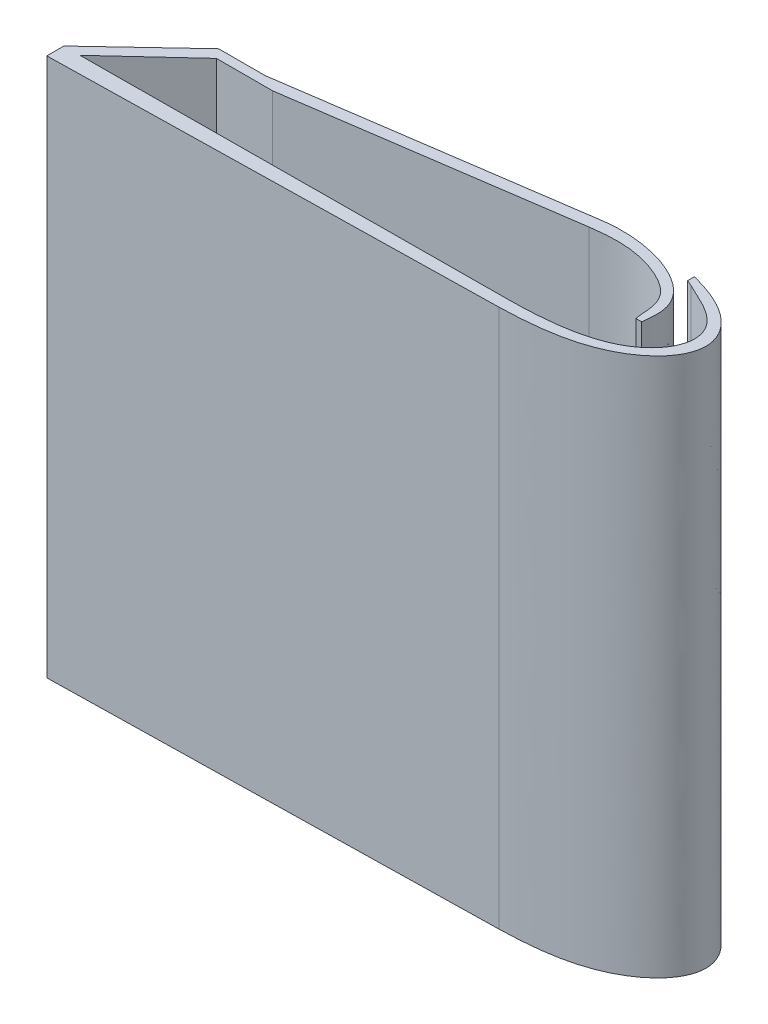
ISO-10303-21;
HEADER;
FILE_DESCRIPTION(('STEP AP214'),'2;1');
FILE_NAME('part.step','',(''),(''),'','','');
FILE_SCHEMA(('AUTOMOTIVE_DESIGN { 1 0 10303 214 1 1 1 1 }'));
ENDSEC;
DATA;
#1=APPLICATION_CONTEXT('core data for automotive mechanical design processes');
#2=APPLICATION_PROTOCOL_DEFINITION('international standard','automotive_design',2000,#1);
#3=PRODUCT_CONTEXT('',#1,'mechanical');
#4=PRODUCT('Part','Part','',(#3));
#5=PRODUCT_RELATED_PRODUCT_CATEGORY('part','',(#4));
#6=PRODUCT_DEFINITION_FORMATION('','',#4);
#7=PRODUCT_DEFINITION_CONTEXT('part definition',#1,'design');
#8=PRODUCT_DEFINITION('design','',#6,#7);
#9=PRODUCT_DEFINITION_SHAPE('','',#8);
#10=(LENGTH_UNIT() NAMED_UNIT(*) SI_UNIT(.MILLI.,.METRE.));
#11=(NAMED_UNIT(*) PLANE_ANGLE_UNIT() SI_UNIT($,.RADIAN.));
#12=(NAMED_UNIT(*) SI_UNIT($,.STERADIAN.) SOLID_ANGLE_UNIT());
#13=UNCERTAINTY_MEASURE_WITH_UNIT(LENGTH_MEASURE(1.E-05),#10,'distance_accuracy_value','');
#14=(GEOMETRIC_REPRESENTATION_CONTEXT(3) GLOBAL_UNCERTAINTY_ASSIGNED_CONTEXT((#13)) GLOBAL_UNIT_ASSIGNED_CONTEXT((#10,
#11,#12)) REPRESENTATION_CONTEXT('',''));
#15=CARTESIAN_POINT('',(0.,0.,0.));
#16=DIRECTION('',(0.,0.,1.));
#17=DIRECTION('',(1.,0.,0.));
#18=AXIS2_PLACEMENT_3D('',#15,#16,#17);
#19=CARTESIAN_POINT('',(11.8502255321829,80.,-13.6725618085625));
#20=DIRECTION('',(0.,0.,1.));
#21=DIRECTION('',(1.,0.,0.));
#22=AXIS2_PLACEMENT_3D('',#19,#20,#21);
#23=PLANE('',#22);
#24=DIRECTION('',(-1.,0.,0.));
#25=VECTOR('',#24,1.);
#26=CARTESIAN_POINT('',(11.8502255321829,0.,-13.6725618085625));
#27=LINE('',#26,#25);
#28=CARTESIAN_POINT('',(18.752013582639,0.,-13.6725618085625));
#29=VERTEX_POINT('',#28);
#30=CARTESIAN_POINT('',(11.8502255321829,0.,-13.6725618085625));
#31=VERTEX_POINT('',#30);
#32=EDGE_CURVE('E341',#29,#31,#27,.T.);
#33=ORIENTED_EDGE('',*,*,#32,.T.);
#34=DIRECTION('',(0.,-1.,0.));
#35=VECTOR('',#34,1.);
#36=CARTESIAN_POINT('',(11.8502255321829,80.,-13.6725618085625));
#37=LINE('',#36,#35);
#38=CARTESIAN_POINT('',(11.8502255321829,80.,-13.6725618085625));
#39=VERTEX_POINT('',#38);
#40=EDGE_CURVE('E11',#39,#31,#37,.T.);
#41=ORIENTED_EDGE('',*,*,#40,.F.);
#42=DIRECTION('',(-1.,0.,0.));
#43=VECTOR('',#42,1.);
#44=CARTESIAN_POINT('',(11.8502255321829,80.,-13.6725618085625));
#45=LINE('',#44,#43);
#46=CARTESIAN_POINT('',(18.752013582639,80.,-13.6725618085625));
#47=VERTEX_POINT('',#46);
#48=EDGE_CURVE('E378',#47,#39,#45,.T.);
#49=ORIENTED_EDGE('',*,*,#48,.F.);
#50=DIRECTION('',(0.,-1.,0.));
#51=VECTOR('',#50,1.);
#52=CARTESIAN_POINT('',(18.752013582639,80.,-13.6725618085625));
#53=LINE('',#52,#51);
#54=EDGE_CURVE('E175',#47,#29,#53,.T.);
#55=ORIENTED_EDGE('',*,*,#54,.T.);
#56=EDGE_LOOP('',(#33,#41,#49,#55));
#57=FACE_BOUND('',#56,.T.);
#58=ADVANCED_FACE('F35',(#57),#23,.F.);
#59=CARTESIAN_POINT('',(0.,80.,-2.53170122080573));
#60=DIRECTION('',(0.684963818042656,0.,0.728577084440917));
#61=DIRECTION('',(0.728577084440917,0.,-0.684963818042656));
#62=AXIS2_PLACEMENT_3D('',#59,#60,#61);
#63=PLANE('',#62);
#64=DIRECTION('',(-0.728577084440917,0.,0.684963818042656));
#65=VECTOR('',#64,1.);
#66=CARTESIAN_POINT('',(0.,0.,-2.53170122080573));
#67=LINE('',#66,#65);
#68=CARTESIAN_POINT('',(0.,0.,-2.53170122080573));
#69=VERTEX_POINT('',#68);
#70=EDGE_CURVE('E335',#31,#69,#67,.T.);
#71=ORIENTED_EDGE('',*,*,#70,.T.);
#72=DIRECTION('',(0.,-1.,0.));
#73=VECTOR('',#72,1.);
#74=CARTESIAN_POINT('',(0.,80.,-2.53170122080573));
#75=LINE('',#74,#73);
#76=CARTESIAN_POINT('',(0.,80.,-2.53170122080573));
#77=VERTEX_POINT('',#76);
#78=EDGE_CURVE('E43',#77,#69,#75,.T.);
#79=ORIENTED_EDGE('',*,*,#78,.F.);
#80=DIRECTION('',(-0.728577084440917,0.,0.684963818042656));
#81=VECTOR('',#80,1.);
#82=CARTESIAN_POINT('',(0.,80.,-2.53170122080573));
#83=LINE('',#82,#81);
#84=EDGE_CURVE('E118',#39,#77,#83,.T.);
#85=ORIENTED_EDGE('',*,*,#84,.F.);
#86=ORIENTED_EDGE('',*,*,#40,.T.);
#87=EDGE_LOOP('',(#71,#79,#85,#86));
#88=FACE_BOUND('',#87,.T.);
#89=ADVANCED_FACE('F395',(#88),#63,.F.);
#90=CARTESIAN_POINT('',(0.,80.,0.));
#91=DIRECTION('',(1.,0.,0.));
#92=DIRECTION('',(0.,0.,-1.));
#93=AXIS2_PLACEMENT_3D('',#90,#91,#92);
#94=PLANE('',#93);
#95=DIRECTION('',(0.,0.,1.));
#96=VECTOR('',#95,1.);
#97=CARTESIAN_POINT('',(0.,0.,0.));
#98=LINE('',#97,#96);
#99=CARTESIAN_POINT('',(0.,0.,0.));
#100=VERTEX_POINT('',#99);
#101=EDGE_CURVE('E329',#69,#100,#98,.T.);
#102=ORIENTED_EDGE('',*,*,#101,.T.);
#103=DIRECTION('',(0.,-1.,0.));
#104=VECTOR('',#103,1.);
#105=CARTESIAN_POINT('',(0.,80.,0.));
#106=LINE('',#105,#104);
#107=CARTESIAN_POINT('',(0.,80.,0.));
#108=VERTEX_POINT('',#107);
#109=EDGE_CURVE('E321',#108,#100,#106,.T.);
#110=ORIENTED_EDGE('',*,*,#109,.F.);
#111=DIRECTION('',(0.,0.,1.));
#112=VECTOR('',#111,1.);
#113=CARTESIAN_POINT('',(0.,80.,0.));
#114=LINE('',#113,#112);
#115=EDGE_CURVE('E330',#77,#108,#114,.T.);
#116=ORIENTED_EDGE('',*,*,#115,.F.);
#117=ORIENTED_EDGE('',*,*,#78,.T.);
#118=EDGE_LOOP('',(#102,#110,#116,#117));
#119=FACE_BOUND('',#118,.T.);
#120=ADVANCED_FACE('F327',(#119),#94,.F.);
#121=CARTESIAN_POINT('',(0.,80.,0.));
#122=DIRECTION('',(-0.0190868223282062,0.,-0.999817830013754));
#123=DIRECTION('',(-0.999817830013754,0.,0.0190868223282062));
#124=AXIS2_PLACEMENT_3D('',#121,#122,#123);
#125=PLANE('',#124);
#126=DIRECTION('',(0.999817830013754,0.,-0.0190868223282062));
#127=VECTOR('',#126,1.);
#128=CARTESIAN_POINT('',(0.,0.,0.));
#129=LINE('',#128,#127);
#130=CARTESIAN_POINT('',(65.8986461709387,0.,-1.25802492551741));
#131=VERTEX_POINT('',#130);
#132=EDGE_CURVE('E337',#100,#131,#129,.T.);
#133=ORIENTED_EDGE('',*,*,#132,.T.);
#134=DIRECTION('',(0.,-1.,0.));
#135=VECTOR('',#134,1.);
#136=CARTESIAN_POINT('',(65.8986461709387,80.,-1.25802492551741));
#137=LINE('',#136,#135);
#138=CARTESIAN_POINT('',(65.8986461709387,80.,-1.25802492551741));
#139=VERTEX_POINT('',#138);
#140=EDGE_CURVE('E318',#139,#131,#137,.T.);
#141=ORIENTED_EDGE('',*,*,#140,.F.);
#142=DIRECTION('',(0.999817830013754,0.,-0.0190868223282062));
#143=VECTOR('',#142,1.);
#144=CARTESIAN_POINT('',(0.,80.,0.));
#145=LINE('',#144,#143);
#146=EDGE_CURVE('E253',#108,#139,#145,.T.);
#147=ORIENTED_EDGE('',*,*,#146,.F.);
#148=ORIENTED_EDGE('',*,*,#109,.T.);
#149=EDGE_LOOP('',(#133,#141,#147,#148));
#150=FACE_BOUND('',#149,.T.);
#151=ADVANCED_FACE('F244',(#150),#125,.F.);
#152=CARTESIAN_POINT('',(65.8986461709387,80.,-1.25802492551741));
#153=CARTESIAN_POINT('',(71.6261804742318,80.,-1.36736527367279));
#154=CARTESIAN_POINT('',(75.5471970860919,80.,-2.13947163177114));
#155=CARTESIAN_POINT('',(83.1460051067004,80.,-2.27545301593973));
#156=CARTESIAN_POINT('',(83.9690789300761,80.,-6.95707353405025));
#157=CARTESIAN_POINT('',(91.8384314116689,80.,-10.0088557614399));
#158=CARTESIAN_POINT('',(86.8239541314267,80.,-13.9158318373423));
#159=CARTESIAN_POINT('',(85.4413967770104,80.,-17.4009165161795));
#160=CARTESIAN_POINT('',(80.0436255282191,80.,-18.6263759195708));
#161=CARTESIAN_POINT('',(76.492845436451,80.,-19.6990962686313));
#162=B_SPLINE_CURVE_WITH_KNOTS('',9,(#152,#153,#154,#155,#156,#157,#158,#159,#160,#161),
.UNSPECIFIED.,.F.,.F.,(10,10),(0.,1.),.UNSPECIFIED.);
#163=DIRECTION('',(0.,-1.,0.));
#164=VECTOR('',#163,1.);
#165=SURFACE_OF_LINEAR_EXTRUSION('',#162,#164);
#166=CARTESIAN_POINT('',(65.8986461709387,0.,-1.25802492551741));
#167=CARTESIAN_POINT('',(71.6261804742318,0.,-1.36736527367279));
#168=CARTESIAN_POINT('',(75.5471970860919,0.,-2.13947163177114));
#169=CARTESIAN_POINT('',(83.1460051067004,0.,-2.27545301593973));
#170=CARTESIAN_POINT('',(83.9690789300761,0.,-6.95707353405025));
#171=CARTESIAN_POINT('',(91.8384314116689,0.,-10.0088557614399));
#172=CARTESIAN_POINT('',(86.8239541314267,0.,-13.9158318373423));
#173=CARTESIAN_POINT('',(85.4413967770104,0.,-17.4009165161795));
#174=CARTESIAN_POINT('',(80.0436255282191,0.,-18.6263759195708));
#175=CARTESIAN_POINT('',(76.492845436451,0.,-19.6990962686313));
#176=B_SPLINE_CURVE_WITH_KNOTS('',9,(#166,#167,#168,#169,#170,#171,#172,#173,#174,#175),
.UNSPECIFIED.,.F.,.F.,(10,10),(0.,1.),.UNSPECIFIED.);
#177=CARTESIAN_POINT('',(76.492845436451,0.,-19.6990962686313));
#178=VERTEX_POINT('',#177);
#179=EDGE_CURVE('E339',#131,#178,#176,.T.);
#180=ORIENTED_EDGE('',*,*,#179,.T.);
#181=DIRECTION('',(0.,-1.,0.));
#182=VECTOR('',#181,1.);
#183=CARTESIAN_POINT('',(76.492845436451,80.,-19.6990962686313));
#184=LINE('',#183,#182);
#185=CARTESIAN_POINT('',(76.492845436451,80.,-19.6990962686313));
#186=VERTEX_POINT('',#185);
#187=EDGE_CURVE('E315',#186,#178,#184,.T.);
#188=ORIENTED_EDGE('',*,*,#187,.F.);
#189=EDGE_CURVE('E247',#139,#186,#162,.T.);
#190=ORIENTED_EDGE('',*,*,#189,.F.);
#191=ORIENTED_EDGE('',*,*,#140,.T.);
#192=EDGE_LOOP('',(#180,#188,#190,#191));
#193=FACE_BOUND('',#192,.T.);
#194=ADVANCED_FACE('F239',(#193),#165,.F.);
#195=CARTESIAN_POINT('',(76.492845436451,80.,-19.6990962686313));
#196=DIRECTION('',(1.,0.,0.));
#197=DIRECTION('',(0.,0.,-1.));
#198=AXIS2_PLACEMENT_3D('',#195,#196,#197);
#199=PLANE('',#198);
#200=DIRECTION('',(0.,0.,1.));
#201=VECTOR('',#200,1.);
#202=CARTESIAN_POINT('',(76.492845436451,0.,-19.6990962686313));
#203=LINE('',#202,#201);
#204=CARTESIAN_POINT('',(76.492845436451,0.,-18.6847335560517));
#205=VERTEX_POINT('',#204);
#206=EDGE_CURVE('E347',#178,#205,#203,.T.);
#207=ORIENTED_EDGE('',*,*,#206,.T.);
#208=DIRECTION('',(0.,-1.,0.));
#209=VECTOR('',#208,1.);
#210=CARTESIAN_POINT('',(76.492845436451,80.,-18.6847335560517));
#211=LINE('',#210,#209);
#212=CARTESIAN_POINT('',(76.492845436451,80.,-18.6847335560517));
#213=VERTEX_POINT('',#212);
#214=EDGE_CURVE('E270',#213,#205,#211,.T.);
#215=ORIENTED_EDGE('',*,*,#214,.F.);
#216=DIRECTION('',(0.,0.,1.));
#217=VECTOR('',#216,1.);
#218=CARTESIAN_POINT('',(76.492845436451,80.,-19.6990962686313));
#219=LINE('',#218,#217);
#220=EDGE_CURVE('E252',#186,#213,#219,.T.);
#221=ORIENTED_EDGE('',*,*,#220,.F.);
#222=ORIENTED_EDGE('',*,*,#187,.T.);
#223=EDGE_LOOP('',(#207,#215,#221,#222));
#224=FACE_BOUND('',#223,.T.);
#225=ADVANCED_FACE('F235',(#224),#199,.F.);
#226=CARTESIAN_POINT('',(76.492845436451,80.,-18.6847335560517));
#227=DIRECTION('',(0.402455337108583,0.,-0.915439622057521));
#228=DIRECTION('',(-0.915439622057521,0.,-0.402455337108583));
#229=AXIS2_PLACEMENT_3D('',#226,#227,#228);
#230=PLANE('',#229);
#231=DIRECTION('',(0.915439622057521,0.,0.402455337108583));
#232=VECTOR('',#231,1.);
#233=CARTESIAN_POINT('',(76.492845436451,0.,-18.6847335560517));
#234=LINE('',#233,#232);
#235=CARTESIAN_POINT('',(77.3273000433491,0.,-18.3178817156581));
#236=VERTEX_POINT('',#235);
#237=EDGE_CURVE('E268',#205,#236,#234,.T.);
#238=ORIENTED_EDGE('',*,*,#237,.T.);
#239=DIRECTION('',(0.,-1.,0.));
#240=VECTOR('',#239,1.);
#241=CARTESIAN_POINT('',(77.3273000433491,80.,-18.3178817156581));
#242=LINE('',#241,#240);
#243=CARTESIAN_POINT('',(77.3273000433491,80.,-18.3178817156581));
#244=VERTEX_POINT('',#243);
#245=EDGE_CURVE('E266',#244,#236,#242,.T.);
#246=ORIENTED_EDGE('',*,*,#245,.F.);
#247=DIRECTION('',(0.915439622057521,0.,0.402455337108583));
#248=VECTOR('',#247,1.);
#249=CARTESIAN_POINT('',(76.492845436451,80.,-18.6847335560517));
#250=LINE('',#249,#248);
#251=EDGE_CURVE('E219',#213,#244,#250,.T.);
#252=ORIENTED_EDGE('',*,*,#251,.F.);
#253=ORIENTED_EDGE('',*,*,#214,.T.);
#254=EDGE_LOOP('',(#238,#246,#252,#253));
#255=FACE_BOUND('',#254,.T.);
#256=ADVANCED_FACE('F230',(#255),#230,.F.);
#257=CARTESIAN_POINT('',(77.3273000433491,80.,-18.3178817156581));
#258=CARTESIAN_POINT('',(80.8503986390824,80.,-16.418487187674));
#259=CARTESIAN_POINT('',(86.9170084419523,80.,-15.2408511671169));
#260=CARTESIAN_POINT('',(85.7286299391944,80.,-11.0458082011466));
#261=CARTESIAN_POINT('',(84.3098234268337,80.,-9.71996342880963));
#262=CARTESIAN_POINT('',(84.61142585038,80.,-6.77864383396584));
#263=CARTESIAN_POINT('',(80.5075427484385,80.,-4.95866089310484));
#264=CARTESIAN_POINT('',(77.9727473934529,80.,-4.77919228413985));
#265=CARTESIAN_POINT('',(77.1887503268685,80.,-3.28142171231137));
#266=CARTESIAN_POINT('',(70.722703041989,80.,-2.95755547651348));
#267=CARTESIAN_POINT('',(65.2772208482399,80.,-2.9236177021232));
#268=B_SPLINE_CURVE_WITH_KNOTS('',10,(#257,#258,#259,#260,#261,#262,#263,#264,#265,#266,#267),
.UNSPECIFIED.,.F.,.F.,(11,11),(0.,1.),.UNSPECIFIED.);
#269=DIRECTION('',(0.,-1.,0.));
#270=VECTOR('',#269,1.);
#271=SURFACE_OF_LINEAR_EXTRUSION('',#268,#270);
#272=CARTESIAN_POINT('',(77.3273000433491,0.,-18.3178817156581));
#273=CARTESIAN_POINT('',(80.8503986390824,0.,-16.418487187674));
#274=CARTESIAN_POINT('',(86.9170084419523,0.,-15.2408511671169));
#275=CARTESIAN_POINT('',(85.7286299391944,0.,-11.0458082011466));
#276=CARTESIAN_POINT('',(84.3098234268337,0.,-9.71996342880963));
#277=CARTESIAN_POINT('',(84.61142585038,0.,-6.77864383396584));
#278=CARTESIAN_POINT('',(80.5075427484385,0.,-4.95866089310484));
#279=CARTESIAN_POINT('',(77.9727473934529,0.,-4.77919228413985));
#280=CARTESIAN_POINT('',(77.1887503268685,0.,-3.28142171231137));
#281=CARTESIAN_POINT('',(70.722703041989,0.,-2.95755547651348));
#282=CARTESIAN_POINT('',(65.2772208482399,0.,-2.9236177021232));
#283=B_SPLINE_CURVE_WITH_KNOTS('',10,(#272,#273,#274,#275,#276,#277,#278,#279,#280,#281,#282),
.UNSPECIFIED.,.F.,.F.,(11,11),(0.,1.),.UNSPECIFIED.);
#284=CARTESIAN_POINT('',(65.2772208482399,0.,-2.9236177021232));
#285=VERTEX_POINT('',#284);
#286=EDGE_CURVE('E275',#236,#285,#283,.T.);
#287=ORIENTED_EDGE('',*,*,#286,.T.);
#288=DIRECTION('',(0.,-1.,0.));
#289=VECTOR('',#288,1.);
#290=CARTESIAN_POINT('',(65.2772208482399,80.,-2.9236177021232));
#291=LINE('',#290,#289);
#292=CARTESIAN_POINT('',(65.2772208482399,80.,-2.9236177021232));
#293=VERTEX_POINT('',#292);
#294=EDGE_CURVE('E271',#293,#285,#291,.T.);
#295=ORIENTED_EDGE('',*,*,#294,.F.);
#296=EDGE_CURVE('E214',#244,#293,#268,.T.);
#297=ORIENTED_EDGE('',*,*,#296,.F.);
#298=ORIENTED_EDGE('',*,*,#245,.T.);
#299=EDGE_LOOP('',(#287,#295,#297,#298));
#300=FACE_BOUND('',#299,.T.);
#301=ADVANCED_FACE('F225',(#300),#271,.F.);
#302=CARTESIAN_POINT('',(2.39230105627136,80.,-2.53170122080573));
#303=DIRECTION('',(0.00623215981761664,0.,0.999980579903434));
#304=DIRECTION('',(0.999980579903434,0.,-0.00623215981761664));
#305=AXIS2_PLACEMENT_3D('',#302,#303,#304);
#306=PLANE('',#305);
#307=DIRECTION('',(-0.999980579903434,0.,0.00623215981761664));
#308=VECTOR('',#307,1.);
#309=CARTESIAN_POINT('',(2.39230105627136,0.,-2.53170122080573));
#310=LINE('',#309,#308);
#311=CARTESIAN_POINT('',(2.39230105627136,0.,-2.53170122080573));
#312=VERTEX_POINT('',#311);
#313=EDGE_CURVE('E356',#285,#312,#310,.T.);
#314=ORIENTED_EDGE('',*,*,#313,.T.);
#315=DIRECTION('',(0.,-1.,0.));
#316=VECTOR('',#315,1.);
#317=CARTESIAN_POINT('',(2.39230105627136,80.,-2.53170122080573));
#318=LINE('',#317,#316);
#319=CARTESIAN_POINT('',(2.39230105627136,80.,-2.53170122080573));
#320=VERTEX_POINT('',#319);
#321=EDGE_CURVE('E278',#320,#312,#318,.T.);
#322=ORIENTED_EDGE('',*,*,#321,.F.);
#323=DIRECTION('',(-0.999980579903434,0.,0.00623215981761664));
#324=VECTOR('',#323,1.);
#325=CARTESIAN_POINT('',(2.39230105627136,80.,-2.53170122080573));
#326=LINE('',#325,#324);
#327=EDGE_CURVE('E212',#293,#320,#326,.T.);
#328=ORIENTED_EDGE('',*,*,#327,.F.);
#329=ORIENTED_EDGE('',*,*,#294,.T.);
#330=EDGE_LOOP('',(#314,#322,#328,#329));
#331=FACE_BOUND('',#330,.T.);
#332=ADVANCED_FACE('F229',(#331),#306,.F.);
#333=CARTESIAN_POINT('',(2.39230105627136,80.,-2.53170122080573));
#334=DIRECTION('',(-0.678837274357454,0.,-0.734288740852631));
#335=DIRECTION('',(-0.734288740852632,0.,0.678837274357454));
#336=AXIS2_PLACEMENT_3D('',#333,#334,#335);
#337=PLANE('',#336);
#338=DIRECTION('',(0.734288740852631,0.,-0.678837274357454));
#339=VECTOR('',#338,1.);
#340=CARTESIAN_POINT('',(2.39230105627136,0.,-2.53170122080573));
#341=LINE('',#340,#339);
#342=CARTESIAN_POINT('',(12.9255150003522,0.,-12.26947581302));
#343=VERTEX_POINT('',#342);
#344=EDGE_CURVE('E291',#312,#343,#341,.T.);
#345=ORIENTED_EDGE('',*,*,#344,.T.);
#346=DIRECTION('',(0.,-1.,0.));
#347=VECTOR('',#346,1.);
#348=CARTESIAN_POINT('',(12.9255150003522,80.,-12.26947581302));
#349=LINE('',#348,#347);
#350=CARTESIAN_POINT('',(12.9255150003522,80.,-12.26947581302));
#351=VERTEX_POINT('',#350);
#352=EDGE_CURVE('E288',#351,#343,#349,.T.);
#353=ORIENTED_EDGE('',*,*,#352,.F.);
#354=DIRECTION('',(0.734288740852631,0.,-0.678837274357454));
#355=VECTOR('',#354,1.);
#356=CARTESIAN_POINT('',(2.39230105627136,80.,-2.53170122080573));
#357=LINE('',#356,#355);
#358=EDGE_CURVE('E210',#320,#351,#357,.T.);
#359=ORIENTED_EDGE('',*,*,#358,.F.);
#360=ORIENTED_EDGE('',*,*,#321,.T.);
#361=EDGE_LOOP('',(#345,#353,#359,#360));
#362=FACE_BOUND('',#361,.T.);
#363=ADVANCED_FACE('F289',(#362),#337,.F.);
#364=CARTESIAN_POINT('',(12.9255150003522,80.,-12.26947581302));
#365=DIRECTION('',(0.,0.,-1.));
#366=DIRECTION('',(-1.,0.,0.));
#367=AXIS2_PLACEMENT_3D('',#364,#365,#366);
#368=PLANE('',#367);
#369=DIRECTION('',(1.,0.,0.));
#370=VECTOR('',#369,1.);
#371=CARTESIAN_POINT('',(12.9255150003522,0.,-12.26947581302));
#372=LINE('',#371,#370);
#373=CARTESIAN_POINT('',(21.2633091462779,0.,-12.26947581302));
#374=VERTEX_POINT('',#373);
#375=EDGE_CURVE('E299',#343,#374,#372,.T.);
#376=ORIENTED_EDGE('',*,*,#375,.T.);
#377=DIRECTION('',(0.,-1.,0.));
#378=VECTOR('',#377,1.);
#379=CARTESIAN_POINT('',(21.2633091462779,80.,-12.26947581302));
#380=LINE('',#379,#378);
#381=CARTESIAN_POINT('',(21.2633091462779,80.,-12.26947581302));
#382=VERTEX_POINT('',#381);
#383=EDGE_CURVE('E294',#382,#374,#380,.T.);
#384=ORIENTED_EDGE('',*,*,#383,.F.);
#385=DIRECTION('',(1.,0.,0.));
#386=VECTOR('',#385,1.);
#387=CARTESIAN_POINT('',(12.9255150003522,80.,-12.26947581302));
#388=LINE('',#387,#386);
#389=EDGE_CURVE('E208',#351,#382,#388,.T.);
#390=ORIENTED_EDGE('',*,*,#389,.F.);
#391=ORIENTED_EDGE('',*,*,#352,.T.);
#392=EDGE_LOOP('',(#376,#384,#390,#391));
#393=FACE_BOUND('',#392,.T.);
#394=ADVANCED_FACE('F296',(#393),#368,.F.);
#395=CARTESIAN_POINT('',(21.2633091462779,80.,-12.26947581302));
#396=DIRECTION('',(-0.144306893071729,0.,-0.989532981063281));
#397=DIRECTION('',(-0.989532981063282,0.,0.14430689307173));
#398=AXIS2_PLACEMENT_3D('',#395,#396,#397);
#399=PLANE('',#398);
#400=DIRECTION('',(0.989532981063281,0.,-0.144306893071729));
#401=VECTOR('',#400,1.);
#402=CARTESIAN_POINT('',(21.2633091462779,0.,-12.26947581302));
#403=LINE('',#402,#401);
#404=CARTESIAN_POINT('',(62.279965887445,0.,-18.2510715877736));
#405=VERTEX_POINT('',#404);
#406=EDGE_CURVE('E306',#374,#405,#403,.T.);
#407=ORIENTED_EDGE('',*,*,#406,.T.);
#408=DIRECTION('',(0.,-1.,0.));
#409=VECTOR('',#408,1.);
#410=CARTESIAN_POINT('',(62.279965887445,80.,-18.2510715877736));
#411=LINE('',#410,#409);
#412=CARTESIAN_POINT('',(62.279965887445,80.,-18.2510715877736));
#413=VERTEX_POINT('',#412);
#414=EDGE_CURVE('E302',#413,#405,#411,.T.);
#415=ORIENTED_EDGE('',*,*,#414,.F.);
#416=DIRECTION('',(0.989532981063281,0.,-0.144306893071729));
#417=VECTOR('',#416,1.);
#418=CARTESIAN_POINT('',(21.2633091462779,80.,-12.26947581302));
#419=LINE('',#418,#417);
#420=EDGE_CURVE('E203',#382,#413,#419,.T.);
#421=ORIENTED_EDGE('',*,*,#420,.F.);
#422=ORIENTED_EDGE('',*,*,#383,.T.);
#423=EDGE_LOOP('',(#407,#415,#421,#422));
#424=FACE_BOUND('',#423,.T.);
#425=ADVANCED_FACE('F196',(#424),#399,.F.);
#426=CARTESIAN_POINT('',(62.279965887445,80.,-18.2510715877736));
#427=CARTESIAN_POINT('',(65.8916580168507,80.,-18.7777766899786));
#428=CARTESIAN_POINT('',(70.2401558064831,80.,-18.9522527088351));
#429=CARTESIAN_POINT('',(70.6213964566271,80.,-17.7704066933885));
#430=CARTESIAN_POINT('',(74.7387954781833,80.,-17.0841735231291));
#431=CARTESIAN_POINT('',(78.2462094595088,80.,-15.6354590525816));
#432=CARTESIAN_POINT('',(76.9480179307784,80.,-12.6297449710102));
#433=CARTESIAN_POINT('',(77.5218522242351,80.,-9.95497336543474));
#434=B_SPLINE_CURVE_WITH_KNOTS('',7,(#426,#427,#428,#429,#430,#431,#432,#433),.UNSPECIFIED.,.F.,
.F.,(8,8),(0.,1.),.UNSPECIFIED.);
#435=DIRECTION('',(0.,-1.,0.));
#436=VECTOR('',#435,1.);
#437=SURFACE_OF_LINEAR_EXTRUSION('',#434,#436);
#438=CARTESIAN_POINT('',(62.279965887445,0.,-18.2510715877736));
#439=CARTESIAN_POINT('',(65.8916580168507,0.,-18.7777766899786));
#440=CARTESIAN_POINT('',(70.2401558064831,0.,-18.9522527088351));
#441=CARTESIAN_POINT('',(70.6213964566271,0.,-17.7704066933885));
#442=CARTESIAN_POINT('',(74.7387954781833,0.,-17.0841735231291));
#443=CARTESIAN_POINT('',(78.2462094595088,0.,-15.6354590525816));
#444=CARTESIAN_POINT('',(76.9480179307784,0.,-12.6297449710102));
#445=CARTESIAN_POINT('',(77.5218522242351,0.,-9.95497336543474));
#446=B_SPLINE_CURVE_WITH_KNOTS('',7,(#438,#439,#440,#441,#442,#443,#444,#445),.UNSPECIFIED.,.F.,
.F.,(8,8),(0.,1.),.UNSPECIFIED.);
#447=CARTESIAN_POINT('',(77.5218522242351,0.,-9.95497336543474));
#448=VERTEX_POINT('',#447);
#449=EDGE_CURVE('E309',#405,#448,#446,.T.);
#450=ORIENTED_EDGE('',*,*,#449,.T.);
#451=DIRECTION('',(0.,-1.,0.));
#452=VECTOR('',#451,1.);
#453=CARTESIAN_POINT('',(77.5218522242351,80.,-9.95497336543474));
#454=LINE('',#453,#452);
#455=CARTESIAN_POINT('',(77.5218522242351,80.,-9.95497336543474));
#456=VERTEX_POINT('',#455);
#457=EDGE_CURVE('E170',#456,#448,#454,.T.);
#458=ORIENTED_EDGE('',*,*,#457,.F.);
#459=EDGE_CURVE('E161',#413,#456,#434,.T.);
#460=ORIENTED_EDGE('',*,*,#459,.F.);
#461=ORIENTED_EDGE('',*,*,#414,.T.);
#462=EDGE_LOOP('',(#450,#458,#460,#461));
#463=FACE_BOUND('',#462,.T.);
#464=ADVANCED_FACE('F193',(#463),#437,.F.);
#465=CARTESIAN_POINT('',(77.5218522242351,80.,-9.95497336543474));
#466=DIRECTION('',(-0.0206237163428658,0.,-0.999787308543277));
#467=DIRECTION('',(-0.999787308543277,0.,0.0206237163428658));
#468=AXIS2_PLACEMENT_3D('',#465,#466,#467);
#469=PLANE('',#468);
#470=DIRECTION('',(0.999787308543277,0.,-0.0206237163428658));
#471=VECTOR('',#470,1.);
#472=CARTESIAN_POINT('',(77.5218522242351,0.,-9.95497336543474));
#473=LINE('',#472,#471);
#474=CARTESIAN_POINT('',(78.3707851555067,0.,-9.97248524202995));
#475=VERTEX_POINT('',#474);
#476=EDGE_CURVE('E169',#448,#475,#473,.T.);
#477=ORIENTED_EDGE('',*,*,#476,.T.);
#478=DIRECTION('',(0.,-1.,0.));
#479=VECTOR('',#478,1.);
#480=CARTESIAN_POINT('',(78.3707851555067,80.,-9.97248524202995));
#481=LINE('',#480,#479);
#482=CARTESIAN_POINT('',(78.3707851555067,80.,-9.97248524202995));
#483=VERTEX_POINT('',#482);
#484=EDGE_CURVE('E166',#483,#475,#481,.T.);
#485=ORIENTED_EDGE('',*,*,#484,.F.);
#486=DIRECTION('',(0.999787308543277,0.,-0.0206237163428658));
#487=VECTOR('',#486,1.);
#488=CARTESIAN_POINT('',(77.5218522242351,80.,-9.95497336543474));
#489=LINE('',#488,#487);
#490=EDGE_CURVE('E155',#456,#483,#489,.T.);
#491=ORIENTED_EDGE('',*,*,#490,.F.);
#492=ORIENTED_EDGE('',*,*,#457,.T.);
#493=EDGE_LOOP('',(#477,#485,#491,#492));
#494=FACE_BOUND('',#493,.T.);
#495=ADVANCED_FACE('F167',(#494),#469,.F.);
#496=CARTESIAN_POINT('',(78.3707851555067,80.,-9.97248524202995));
#497=CARTESIAN_POINT('',(78.7401561193342,80.,-12.9153883165742));
#498=CARTESIAN_POINT('',(78.7401561193342,80.,-14.413444837397));
#499=CARTESIAN_POINT('',(77.81396623954,80.,-16.3798522708788));
#500=CARTESIAN_POINT('',(75.7850973056717,80.,-18.285768011302));
#501=CARTESIAN_POINT('',(72.2797873732858,80.,-19.6990962686313));
#502=CARTESIAN_POINT('',(68.4904133845477,80.,-20.7701893467573));
#503=CARTESIAN_POINT('',(64.1904672365677,80.,-20.2990029664269));
#504=CARTESIAN_POINT('',(62.279965887445,80.,-20.0203881863468));
#505=B_SPLINE_CURVE_WITH_KNOTS('',8,(#496,#497,#498,#499,#500,#501,#502,#503,#504),
.UNSPECIFIED.,.F.,.F.,(9,9),(0.,1.),.UNSPECIFIED.);
#506=DIRECTION('',(0.,-1.,0.));
#507=VECTOR('',#506,1.);
#508=SURFACE_OF_LINEAR_EXTRUSION('',#505,#507);
#509=CARTESIAN_POINT('',(78.3707851555067,0.,-9.97248524202995));
#510=CARTESIAN_POINT('',(78.7401561193342,0.,-12.9153883165742));
#511=CARTESIAN_POINT('',(78.7401561193342,0.,-14.413444837397));
#512=CARTESIAN_POINT('',(77.81396623954,0.,-16.3798522708788));
#513=CARTESIAN_POINT('',(75.7850973056717,0.,-18.285768011302));
#514=CARTESIAN_POINT('',(72.2797873732858,0.,-19.6990962686313));
#515=CARTESIAN_POINT('',(68.4904133845477,0.,-20.7701893467573));
#516=CARTESIAN_POINT('',(64.1904672365677,0.,-20.2990029664269));
#517=CARTESIAN_POINT('',(62.279965887445,0.,-20.0203881863468));
#518=B_SPLINE_CURVE_WITH_KNOTS('',8,(#509,#510,#511,#512,#513,#514,#515,#516,#517),
.UNSPECIFIED.,.F.,.F.,(9,9),(0.,1.),.UNSPECIFIED.);
#519=CARTESIAN_POINT('',(62.279965887445,0.,-20.0203881863468));
#520=VERTEX_POINT('',#519);
#521=EDGE_CURVE('E104',#475,#520,#518,.T.);
#522=ORIENTED_EDGE('',*,*,#521,.T.);
#523=DIRECTION('',(0.,-1.,0.));
#524=VECTOR('',#523,1.);
#525=CARTESIAN_POINT('',(62.279965887445,80.,-20.0203881863468));
#526=LINE('',#525,#524);
#527=CARTESIAN_POINT('',(62.279965887445,80.,-20.0203881863468));
#528=VERTEX_POINT('',#527);
#529=EDGE_CURVE('E171',#528,#520,#526,.T.);
#530=ORIENTED_EDGE('',*,*,#529,.F.);
#531=EDGE_CURVE('E159',#483,#528,#505,.T.);
#532=ORIENTED_EDGE('',*,*,#531,.F.);
#533=ORIENTED_EDGE('',*,*,#484,.T.);
#534=EDGE_LOOP('',(#522,#530,#532,#533));
#535=FACE_BOUND('',#534,.T.);
#536=ADVANCED_FACE('F173',(#535),#508,.F.);
#537=CARTESIAN_POINT('',(18.752013582639,80.,-13.6725618085625));
#538=DIRECTION('',(0.144306893071729,0.,0.989532981063281));
#539=DIRECTION('',(0.989532981063281,0.,-0.144306893071729));
#540=AXIS2_PLACEMENT_3D('',#537,#538,#539);
#541=PLANE('',#540);
#542=DIRECTION('',(-0.989532981063281,0.,0.144306893071729));
#543=VECTOR('',#542,1.);
#544=CARTESIAN_POINT('',(18.752013582639,0.,-13.6725618085625));
#545=LINE('',#544,#543);
#546=EDGE_CURVE('E110',#520,#29,#545,.T.);
#547=ORIENTED_EDGE('',*,*,#546,.T.);
#548=ORIENTED_EDGE('',*,*,#54,.F.);
#549=DIRECTION('',(-0.989532981063281,0.,0.144306893071729));
#550=VECTOR('',#549,1.);
#551=CARTESIAN_POINT('',(18.752013582639,80.,-13.6725618085625));
#552=LINE('',#551,#550);
#553=EDGE_CURVE('E51',#528,#47,#552,.T.);
#554=ORIENTED_EDGE('',*,*,#553,.F.);
#555=ORIENTED_EDGE('',*,*,#529,.T.);
#556=EDGE_LOOP('',(#547,#548,#554,#555));
#557=FACE_BOUND('',#556,.T.);
#558=ADVANCED_FACE('F189',(#557),#541,.F.);
#559=CARTESIAN_POINT('',(74.6748386629458,80.,-17.8956040619235));
#560=DIRECTION('',(0.,1.,0.));
#561=DIRECTION('',(0.,0.,1.));
#562=AXIS2_PLACEMENT_3D('',#559,#560,#561);
#563=PLANE('',#562);
#564=ORIENTED_EDGE('',*,*,#48,.T.);
#565=ORIENTED_EDGE('',*,*,#84,.T.);
#566=ORIENTED_EDGE('',*,*,#115,.T.);
#567=ORIENTED_EDGE('',*,*,#146,.T.);
#568=ORIENTED_EDGE('',*,*,#189,.T.);
#569=ORIENTED_EDGE('',*,*,#220,.T.);
#570=ORIENTED_EDGE('',*,*,#251,.T.);
#571=ORIENTED_EDGE('',*,*,#296,.T.);
#572=ORIENTED_EDGE('',*,*,#327,.T.);
#573=ORIENTED_EDGE('',*,*,#358,.T.);
#574=ORIENTED_EDGE('',*,*,#389,.T.);
#575=ORIENTED_EDGE('',*,*,#420,.T.);
#576=ORIENTED_EDGE('',*,*,#459,.T.);
#577=ORIENTED_EDGE('',*,*,#490,.T.);
#578=ORIENTED_EDGE('',*,*,#531,.T.);
#579=ORIENTED_EDGE('',*,*,#553,.T.);
#580=EDGE_LOOP('',(#564,#565,#566,#567,#568,#569,#570,#571,#572,#573,#574,#575,#576,#577,#578,#579));
#581=FACE_BOUND('',#580,.T.);
#582=ADVANCED_FACE('F157',(#581),#563,.T.);
#583=CARTESIAN_POINT('',(74.6748386629458,0.,-17.8956040619235));
#584=DIRECTION('',(0.,1.,0.));
#585=DIRECTION('',(0.,0.,1.));
#586=AXIS2_PLACEMENT_3D('',#583,#584,#585);
#587=PLANE('',#586);
#588=ORIENTED_EDGE('',*,*,#32,.F.);
#589=ORIENTED_EDGE('',*,*,#546,.F.);
#590=ORIENTED_EDGE('',*,*,#521,.F.);
#591=ORIENTED_EDGE('',*,*,#476,.F.);
#592=ORIENTED_EDGE('',*,*,#449,.F.);
#593=ORIENTED_EDGE('',*,*,#406,.F.);
#594=ORIENTED_EDGE('',*,*,#375,.F.);
#595=ORIENTED_EDGE('',*,*,#344,.F.);
#596=ORIENTED_EDGE('',*,*,#313,.F.);
#597=ORIENTED_EDGE('',*,*,#286,.F.);
#598=ORIENTED_EDGE('',*,*,#237,.F.);
#599=ORIENTED_EDGE('',*,*,#206,.F.);
#600=ORIENTED_EDGE('',*,*,#179,.F.);
#601=ORIENTED_EDGE('',*,*,#132,.F.);
#602=ORIENTED_EDGE('',*,*,#101,.F.);
#603=ORIENTED_EDGE('',*,*,#70,.F.);
#604=EDGE_LOOP('',(#588,#589,#590,#591,#592,#593,#594,#595,#596,#597,#598,#599,#600,#601,#602,#603));
#605=FACE_BOUND('',#604,.T.);
#606=ADVANCED_FACE('F334',(#605),#587,.F.);
#607=CLOSED_SHELL('',(#58,#89,#120,#151,#194,#225,#256,#301,#332,#363,#394,#425,#464,#495,#536,
#558,#582,#606));
#608=MANIFOLD_SOLID_BREP('B2',#607);
#609=ADVANCED_BREP_SHAPE_REPRESENTATION('',(#18,#608),#14);
#610=SHAPE_DEFINITION_REPRESENTATION(#9,#609);
ENDSEC;
END-ISO-10303-21;
